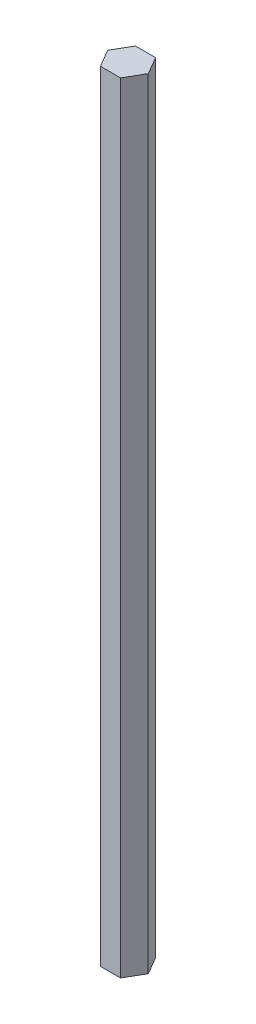
ISO-10303-21;
HEADER;
FILE_DESCRIPTION(('STEP AP214'),'2;1');
FILE_NAME('part.step','',(''),(''),'','','');
FILE_SCHEMA(('AUTOMOTIVE_DESIGN { 1 0 10303 214 1 1 1 1 }'));
ENDSEC;
DATA;
#1=APPLICATION_CONTEXT('core data for automotive mechanical design processes');
#2=APPLICATION_PROTOCOL_DEFINITION('international standard','automotive_design',2000,#1);
#3=PRODUCT_CONTEXT('',#1,'mechanical');
#4=PRODUCT('Part','Part','',(#3));
#5=PRODUCT_RELATED_PRODUCT_CATEGORY('part','',(#4));
#6=PRODUCT_DEFINITION_FORMATION('','',#4);
#7=PRODUCT_DEFINITION_CONTEXT('part definition',#1,'design');
#8=PRODUCT_DEFINITION('design','',#6,#7);
#9=PRODUCT_DEFINITION_SHAPE('','',#8);
#10=(LENGTH_UNIT() NAMED_UNIT(*) SI_UNIT(.MILLI.,.METRE.));
#11=(NAMED_UNIT(*) PLANE_ANGLE_UNIT() SI_UNIT($,.RADIAN.));
#12=(NAMED_UNIT(*) SI_UNIT($,.STERADIAN.) SOLID_ANGLE_UNIT());
#13=UNCERTAINTY_MEASURE_WITH_UNIT(LENGTH_MEASURE(1.E-05),#10,'distance_accuracy_value','');
#14=(GEOMETRIC_REPRESENTATION_CONTEXT(3) GLOBAL_UNCERTAINTY_ASSIGNED_CONTEXT((#13)) GLOBAL_UNIT_ASSIGNED_CONTEXT((#10,
#11,#12)) REPRESENTATION_CONTEXT('',''));
#15=CARTESIAN_POINT('',(0.,0.,0.));
#16=DIRECTION('',(0.,0.,1.));
#17=DIRECTION('',(1.,0.,0.));
#18=AXIS2_PLACEMENT_3D('',#15,#16,#17);
#19=CARTESIAN_POINT('',(0.866025403784457,10.0346094779188,1.49999999999999));
#20=DIRECTION('',(-0.866025403784441,0.,-0.499999999999995));
#21=DIRECTION('',(-0.499999999999995,0.,0.866025403784442));
#22=AXIS2_PLACEMENT_3D('',#19,#20,#21);
#23=PLANE('',#22);
#24=DIRECTION('',(0.499999999999995,0.,-0.866025403784442));
#25=VECTOR('',#24,1.);
#26=CARTESIAN_POINT('',(0.866025403784457,5.45203378296293,1.49999999999999));
#27=LINE('',#26,#25);
#28=CARTESIAN_POINT('',(0.866025403784457,5.45203378296293,1.49999999999999));
#29=VERTEX_POINT('',#28);
#30=CARTESIAN_POINT('',(1.73205080756888,5.45203378296293,0.));
#31=VERTEX_POINT('',#30);
#32=EDGE_CURVE('E39',#29,#31,#27,.T.);
#33=ORIENTED_EDGE('',*,*,#32,.F.);
#34=DIRECTION('',(0.,-1.,0.));
#35=VECTOR('',#34,1.);
#36=CARTESIAN_POINT('',(0.866025403784457,10.0346094779188,1.49999999999999));
#37=LINE('',#36,#35);
#38=CARTESIAN_POINT('',(0.866025403784457,-61.3,1.49999999999999));
#39=VERTEX_POINT('',#38);
#40=EDGE_CURVE('E110',#29,#39,#37,.T.);
#41=ORIENTED_EDGE('',*,*,#40,.T.);
#42=DIRECTION('',(-0.499999999999995,0.,0.866025403784442));
#43=VECTOR('',#42,1.);
#44=CARTESIAN_POINT('',(0.866025403784457,-61.3,1.49999999999999));
#45=LINE('',#44,#43);
#46=CARTESIAN_POINT('',(1.73205080756888,-61.3,0.));
#47=VERTEX_POINT('',#46);
#48=EDGE_CURVE('E111',#47,#39,#45,.T.);
#49=ORIENTED_EDGE('',*,*,#48,.F.);
#50=DIRECTION('',(0.,-1.,0.));
#51=VECTOR('',#50,1.);
#52=CARTESIAN_POINT('',(1.73205080756888,10.0346094779188,0.));
#53=LINE('',#52,#51);
#54=EDGE_CURVE('E94',#31,#47,#53,.T.);
#55=ORIENTED_EDGE('',*,*,#54,.F.);
#56=EDGE_LOOP('',(#33,#41,#49,#55));
#57=FACE_BOUND('',#56,.T.);
#58=ADVANCED_FACE('F32',(#57),#23,.F.);
#59=CARTESIAN_POINT('',(1.73205080756888,10.0346094779188,0.));
#60=DIRECTION('',(-0.866025403784438,0.,0.500000000000001));
#61=DIRECTION('',(0.500000000000001,0.,0.866025403784438));
#62=AXIS2_PLACEMENT_3D('',#59,#60,#61);
#63=PLANE('',#62);
#64=DIRECTION('',(-0.500000000000001,0.,-0.866025403784438));
#65=VECTOR('',#64,1.);
#66=CARTESIAN_POINT('',(1.73205080756888,5.45203378296293,0.));
#67=LINE('',#66,#65);
#68=CARTESIAN_POINT('',(0.866025403784436,5.45203378296293,-1.5));
#69=VERTEX_POINT('',#68);
#70=EDGE_CURVE('E49',#31,#69,#67,.T.);
#71=ORIENTED_EDGE('',*,*,#70,.F.);
#72=ORIENTED_EDGE('',*,*,#54,.T.);
#73=DIRECTION('',(0.500000000000001,0.,0.866025403784438));
#74=VECTOR('',#73,1.);
#75=CARTESIAN_POINT('',(1.73205080756888,-61.3,0.));
#76=LINE('',#75,#74);
#77=CARTESIAN_POINT('',(0.866025403784436,-61.3,-1.5));
#78=VERTEX_POINT('',#77);
#79=EDGE_CURVE('E102',#78,#47,#76,.T.);
#80=ORIENTED_EDGE('',*,*,#79,.F.);
#81=DIRECTION('',(0.,-1.,0.));
#82=VECTOR('',#81,1.);
#83=CARTESIAN_POINT('',(0.866025403784436,10.0346094779188,-1.5));
#84=LINE('',#83,#82);
#85=EDGE_CURVE('E86',#69,#78,#84,.T.);
#86=ORIENTED_EDGE('',*,*,#85,.F.);
#87=EDGE_LOOP('',(#71,#72,#80,#86));
#88=FACE_BOUND('',#87,.T.);
#89=ADVANCED_FACE('F108',(#88),#63,.F.);
#90=CARTESIAN_POINT('',(0.866025403784436,10.0346094779188,-1.5));
#91=DIRECTION('',(0.,0.,1.));
#92=DIRECTION('',(1.,0.,0.));
#93=AXIS2_PLACEMENT_3D('',#90,#91,#92);
#94=PLANE('',#93);
#95=DIRECTION('',(-1.,0.,0.));
#96=VECTOR('',#95,1.);
#97=CARTESIAN_POINT('',(0.866025403784436,5.45203378296293,-1.5));
#98=LINE('',#97,#96);
#99=CARTESIAN_POINT('',(-0.866025403784446,5.45203378296293,-1.5));
#100=VERTEX_POINT('',#99);
#101=EDGE_CURVE('E91',#69,#100,#98,.T.);
#102=ORIENTED_EDGE('',*,*,#101,.F.);
#103=ORIENTED_EDGE('',*,*,#85,.T.);
#104=DIRECTION('',(1.,0.,0.));
#105=VECTOR('',#104,1.);
#106=CARTESIAN_POINT('',(0.866025403784436,-61.3,-1.5));
#107=LINE('',#106,#105);
#108=CARTESIAN_POINT('',(-0.866025403784446,-61.3,-1.5));
#109=VERTEX_POINT('',#108);
#110=EDGE_CURVE('E90',#109,#78,#107,.T.);
#111=ORIENTED_EDGE('',*,*,#110,.F.);
#112=DIRECTION('',(0.,-1.,0.));
#113=VECTOR('',#112,1.);
#114=CARTESIAN_POINT('',(-0.866025403784446,10.0346094779188,-1.5));
#115=LINE('',#114,#113);
#116=EDGE_CURVE('E95',#100,#109,#115,.T.);
#117=ORIENTED_EDGE('',*,*,#116,.F.);
#118=EDGE_LOOP('',(#102,#103,#111,#117));
#119=FACE_BOUND('',#118,.T.);
#120=ADVANCED_FACE('F88',(#119),#94,.F.);
#121=CARTESIAN_POINT('',(-0.866025403784446,10.0346094779188,-1.5));
#122=DIRECTION('',(0.866025403784442,0.,0.499999999999995));
#123=DIRECTION('',(0.499999999999995,0.,-0.866025403784442));
#124=AXIS2_PLACEMENT_3D('',#121,#122,#123);
#125=PLANE('',#124);
#126=DIRECTION('',(-0.499999999999995,0.,0.866025403784442));
#127=VECTOR('',#126,1.);
#128=CARTESIAN_POINT('',(-0.866025403784446,5.45203378296293,-1.5));
#129=LINE('',#128,#127);
#130=CARTESIAN_POINT('',(-1.73205080756888,5.45203378296293,0.));
#131=VERTEX_POINT('',#130);
#132=EDGE_CURVE('E59',#100,#131,#129,.T.);
#133=ORIENTED_EDGE('',*,*,#132,.F.);
#134=ORIENTED_EDGE('',*,*,#116,.T.);
#135=DIRECTION('',(0.499999999999995,0.,-0.866025403784442));
#136=VECTOR('',#135,1.);
#137=CARTESIAN_POINT('',(-0.866025403784446,-61.3,-1.5));
#138=LINE('',#137,#136);
#139=CARTESIAN_POINT('',(-1.73205080756888,-61.3,0.));
#140=VERTEX_POINT('',#139);
#141=EDGE_CURVE('E106',#140,#109,#138,.T.);
#142=ORIENTED_EDGE('',*,*,#141,.F.);
#143=DIRECTION('',(0.,-1.,0.));
#144=VECTOR('',#143,1.);
#145=CARTESIAN_POINT('',(-1.73205080756888,10.0346094779188,0.));
#146=LINE('',#145,#144);
#147=EDGE_CURVE('E125',#131,#140,#146,.T.);
#148=ORIENTED_EDGE('',*,*,#147,.F.);
#149=EDGE_LOOP('',(#133,#134,#142,#148));
#150=FACE_BOUND('',#149,.T.);
#151=ADVANCED_FACE('F128',(#150),#125,.F.);
#152=CARTESIAN_POINT('',(-1.73205080756888,10.0346094779188,0.));
#153=DIRECTION('',(0.866025403784435,0.,-0.500000000000007));
#154=DIRECTION('',(-0.500000000000007,0.,-0.866025403784435));
#155=AXIS2_PLACEMENT_3D('',#152,#153,#154);
#156=PLANE('',#155);
#157=DIRECTION('',(0.500000000000007,0.,0.866025403784435));
#158=VECTOR('',#157,1.);
#159=CARTESIAN_POINT('',(-1.73205080756888,5.45203378296293,0.));
#160=LINE('',#159,#158);
#161=CARTESIAN_POINT('',(-0.866025403784425,5.45203378296293,1.50000000000001));
#162=VERTEX_POINT('',#161);
#163=EDGE_CURVE('E64',#131,#162,#160,.T.);
#164=ORIENTED_EDGE('',*,*,#163,.F.);
#165=ORIENTED_EDGE('',*,*,#147,.T.);
#166=DIRECTION('',(-0.500000000000007,0.,-0.866025403784435));
#167=VECTOR('',#166,1.);
#168=CARTESIAN_POINT('',(-1.73205080756888,-61.3,0.));
#169=LINE('',#168,#167);
#170=CARTESIAN_POINT('',(-0.866025403784425,-61.3,1.50000000000001));
#171=VERTEX_POINT('',#170);
#172=EDGE_CURVE('E133',#171,#140,#169,.T.);
#173=ORIENTED_EDGE('',*,*,#172,.F.);
#174=DIRECTION('',(0.,-1.,0.));
#175=VECTOR('',#174,1.);
#176=CARTESIAN_POINT('',(-0.866025403784425,10.0346094779188,1.50000000000001));
#177=LINE('',#176,#175);
#178=EDGE_CURVE('E113',#162,#171,#177,.T.);
#179=ORIENTED_EDGE('',*,*,#178,.F.);
#180=EDGE_LOOP('',(#164,#165,#173,#179));
#181=FACE_BOUND('',#180,.T.);
#182=ADVANCED_FACE('F132',(#181),#156,.F.);
#183=CARTESIAN_POINT('',(-0.866025403784425,10.0346094779188,1.50000000000001));
#184=DIRECTION('',(0.,0.,-1.));
#185=DIRECTION('',(-1.,0.,0.));
#186=AXIS2_PLACEMENT_3D('',#183,#184,#185);
#187=PLANE('',#186);
#188=DIRECTION('',(1.,0.,0.));
#189=VECTOR('',#188,1.);
#190=CARTESIAN_POINT('',(-0.866025403784425,5.45203378296293,1.50000000000001));
#191=LINE('',#190,#189);
#192=EDGE_CURVE('E11',#162,#29,#191,.T.);
#193=ORIENTED_EDGE('',*,*,#192,.F.);
#194=ORIENTED_EDGE('',*,*,#178,.T.);
#195=DIRECTION('',(-1.,0.,0.));
#196=VECTOR('',#195,1.);
#197=CARTESIAN_POINT('',(-0.866025403784425,-61.3,1.50000000000001));
#198=LINE('',#197,#196);
#199=EDGE_CURVE('E115',#39,#171,#198,.T.);
#200=ORIENTED_EDGE('',*,*,#199,.F.);
#201=ORIENTED_EDGE('',*,*,#40,.F.);
#202=EDGE_LOOP('',(#193,#194,#200,#201));
#203=FACE_BOUND('',#202,.T.);
#204=ADVANCED_FACE('F140',(#203),#187,.F.);
#205=CARTESIAN_POINT('',(0.,5.45203378296293,0.));
#206=DIRECTION('',(0.,1.,0.));
#207=DIRECTION('',(-0.866025403784443,0.,-0.499999999999993));
#208=AXIS2_PLACEMENT_3D('',#205,#206,#207);
#209=PLANE('',#208);
#210=ORIENTED_EDGE('',*,*,#32,.T.);
#211=ORIENTED_EDGE('',*,*,#70,.T.);
#212=ORIENTED_EDGE('',*,*,#101,.T.);
#213=ORIENTED_EDGE('',*,*,#132,.T.);
#214=ORIENTED_EDGE('',*,*,#163,.T.);
#215=ORIENTED_EDGE('',*,*,#192,.T.);
#216=EDGE_LOOP('',(#210,#211,#212,#213,#214,#215));
#217=FACE_BOUND('',#216,.T.);
#218=ADVANCED_FACE('F157',(#217),#209,.T.);
#219=CARTESIAN_POINT('',(0.,-61.3,0.));
#220=DIRECTION('',(0.,1.,0.));
#221=DIRECTION('',(0.866025403784443,0.,0.499999999999993));
#222=AXIS2_PLACEMENT_3D('',#219,#220,#221);
#223=PLANE('',#222);
#224=ORIENTED_EDGE('',*,*,#48,.T.);
#225=ORIENTED_EDGE('',*,*,#199,.T.);
#226=ORIENTED_EDGE('',*,*,#172,.T.);
#227=ORIENTED_EDGE('',*,*,#141,.T.);
#228=ORIENTED_EDGE('',*,*,#110,.T.);
#229=ORIENTED_EDGE('',*,*,#79,.T.);
#230=EDGE_LOOP('',(#224,#225,#226,#227,#228,#229));
#231=FACE_BOUND('',#230,.T.);
#232=ADVANCED_FACE('F101',(#231),#223,.F.);
#233=CLOSED_SHELL('',(#58,#89,#120,#151,#182,#204,#218,#232));
#234=MANIFOLD_SOLID_BREP('B2',#233);
#235=ADVANCED_BREP_SHAPE_REPRESENTATION('',(#18,#234),#14);
#236=SHAPE_DEFINITION_REPRESENTATION(#9,#235);
ENDSEC;
END-ISO-10303-21;
